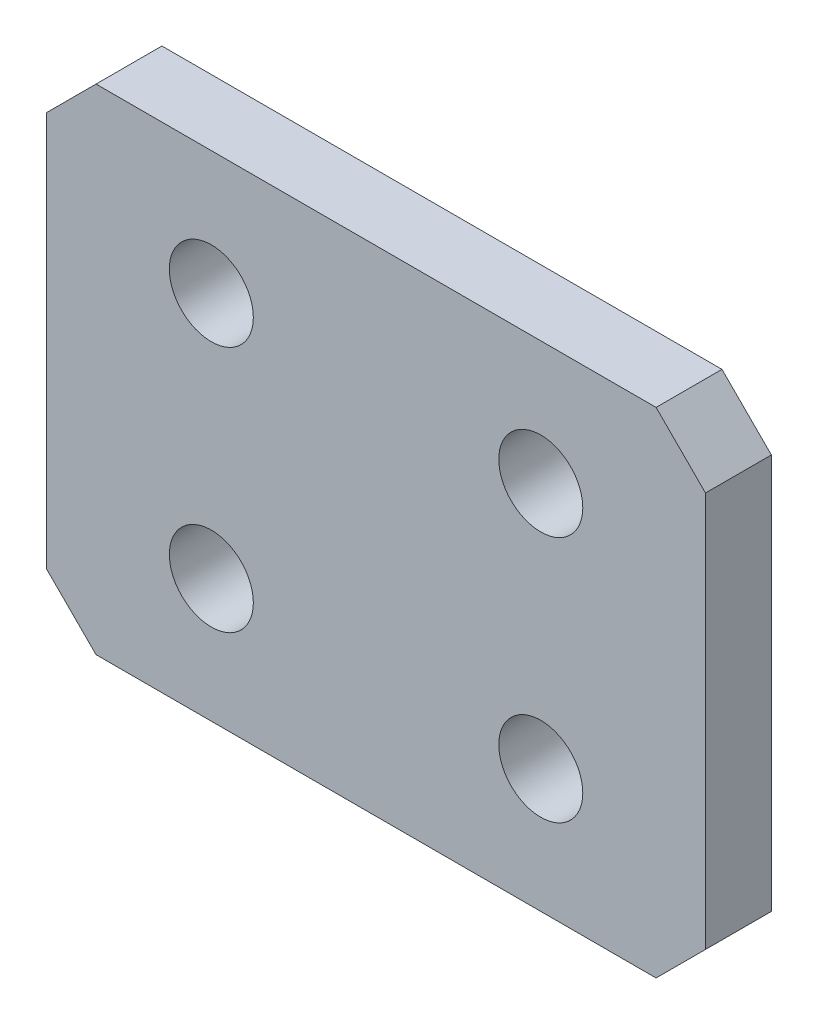
ISO-10303-21;
HEADER;
FILE_DESCRIPTION(('STEP AP214'),'2;1');
FILE_NAME('part.step','',(''),(''),'','','');
FILE_SCHEMA(('AUTOMOTIVE_DESIGN { 1 0 10303 214 1 1 1 1 }'));
ENDSEC;
DATA;
#1=APPLICATION_CONTEXT('core data for automotive mechanical design processes');
#2=APPLICATION_PROTOCOL_DEFINITION('international standard','automotive_design',2000,#1);
#3=PRODUCT_CONTEXT('',#1,'mechanical');
#4=PRODUCT('Part','Part','',(#3));
#5=PRODUCT_RELATED_PRODUCT_CATEGORY('part','',(#4));
#6=PRODUCT_DEFINITION_FORMATION('','',#4);
#7=PRODUCT_DEFINITION_CONTEXT('part definition',#1,'design');
#8=PRODUCT_DEFINITION('design','',#6,#7);
#9=PRODUCT_DEFINITION_SHAPE('','',#8);
#10=(LENGTH_UNIT() NAMED_UNIT(*) SI_UNIT(.MILLI.,.METRE.));
#11=(NAMED_UNIT(*) PLANE_ANGLE_UNIT() SI_UNIT($,.RADIAN.));
#12=(NAMED_UNIT(*) SI_UNIT($,.STERADIAN.) SOLID_ANGLE_UNIT());
#13=UNCERTAINTY_MEASURE_WITH_UNIT(LENGTH_MEASURE(1.E-05),#10,'distance_accuracy_value','');
#14=(GEOMETRIC_REPRESENTATION_CONTEXT(3) GLOBAL_UNCERTAINTY_ASSIGNED_CONTEXT((#13)) GLOBAL_UNIT_ASSIGNED_CONTEXT((#10,
#11,#12)) REPRESENTATION_CONTEXT('',''));
#15=CARTESIAN_POINT('',(0.,0.,0.));
#16=DIRECTION('',(0.,0.,1.));
#17=DIRECTION('',(1.,0.,0.));
#18=AXIS2_PLACEMENT_3D('',#15,#16,#17);
#19=CARTESIAN_POINT('',(20.,-15.,4.));
#20=DIRECTION('',(-1.,0.,0.));
#21=DIRECTION('',(0.,0.,1.));
#22=AXIS2_PLACEMENT_3D('',#19,#20,#21);
#23=PLANE('',#22);
#24=DIRECTION('',(0.,1.,0.));
#25=VECTOR('',#24,1.);
#26=CARTESIAN_POINT('',(20.,-15.,4.));
#27=LINE('',#26,#25);
#28=CARTESIAN_POINT('',(20.,-12.,4.));
#29=VERTEX_POINT('',#28);
#30=CARTESIAN_POINT('',(20.,12.,4.));
#31=VERTEX_POINT('',#30);
#32=EDGE_CURVE('E125',#29,#31,#27,.T.);
#33=ORIENTED_EDGE('',*,*,#32,.F.);
#34=DIRECTION('',(0.,0.,-1.));
#35=VECTOR('',#34,1.);
#36=CARTESIAN_POINT('',(20.,-12.,4.));
#37=LINE('',#36,#35);
#38=CARTESIAN_POINT('',(20.,-12.,0.));
#39=VERTEX_POINT('',#38);
#40=EDGE_CURVE('E110',#29,#39,#37,.T.);
#41=ORIENTED_EDGE('',*,*,#40,.T.);
#42=DIRECTION('',(0.,1.,0.));
#43=VECTOR('',#42,1.);
#44=CARTESIAN_POINT('',(20.,-15.,0.));
#45=LINE('',#44,#43);
#46=CARTESIAN_POINT('',(20.,12.,0.));
#47=VERTEX_POINT('',#46);
#48=EDGE_CURVE('E122',#39,#47,#45,.T.);
#49=ORIENTED_EDGE('',*,*,#48,.T.);
#50=DIRECTION('',(0.,0.,1.));
#51=VECTOR('',#50,1.);
#52=CARTESIAN_POINT('',(20.,12.,4.));
#53=LINE('',#52,#51);
#54=EDGE_CURVE('E127',#47,#31,#53,.T.);
#55=ORIENTED_EDGE('',*,*,#54,.T.);
#56=EDGE_LOOP('',(#33,#41,#49,#55));
#57=FACE_BOUND('',#56,.T.);
#58=ADVANCED_FACE('F38',(#57),#23,.F.);
#59=CARTESIAN_POINT('',(-20.,15.,4.));
#60=DIRECTION('',(0.,-1.,0.));
#61=DIRECTION('',(0.,0.,-1.));
#62=AXIS2_PLACEMENT_3D('',#59,#60,#61);
#63=PLANE('',#62);
#64=DIRECTION('',(-1.,0.,0.));
#65=VECTOR('',#64,1.);
#66=CARTESIAN_POINT('',(-20.,15.,4.));
#67=LINE('',#66,#65);
#68=CARTESIAN_POINT('',(17.,15.,4.));
#69=VERTEX_POINT('',#68);
#70=CARTESIAN_POINT('',(-17.,15.,4.));
#71=VERTEX_POINT('',#70);
#72=EDGE_CURVE('E169',#69,#71,#67,.T.);
#73=ORIENTED_EDGE('',*,*,#72,.F.);
#74=DIRECTION('',(0.,0.,-1.));
#75=VECTOR('',#74,1.);
#76=CARTESIAN_POINT('',(17.,15.,4.));
#77=LINE('',#76,#75);
#78=CARTESIAN_POINT('',(17.,15.,0.));
#79=VERTEX_POINT('',#78);
#80=EDGE_CURVE('E11',#69,#79,#77,.T.);
#81=ORIENTED_EDGE('',*,*,#80,.T.);
#82=DIRECTION('',(-1.,0.,0.));
#83=VECTOR('',#82,1.);
#84=CARTESIAN_POINT('',(-20.,15.,0.));
#85=LINE('',#84,#83);
#86=CARTESIAN_POINT('',(-17.,15.,0.));
#87=VERTEX_POINT('',#86);
#88=EDGE_CURVE('E132',#79,#87,#85,.T.);
#89=ORIENTED_EDGE('',*,*,#88,.T.);
#90=DIRECTION('',(0.,0.,1.));
#91=VECTOR('',#90,1.);
#92=CARTESIAN_POINT('',(-17.,15.,4.));
#93=LINE('',#92,#91);
#94=EDGE_CURVE('E47',#87,#71,#93,.T.);
#95=ORIENTED_EDGE('',*,*,#94,.T.);
#96=EDGE_LOOP('',(#73,#81,#89,#95));
#97=FACE_BOUND('',#96,.T.);
#98=ADVANCED_FACE('F168',(#97),#63,.F.);
#99=CARTESIAN_POINT('',(-20.,-15.,4.));
#100=DIRECTION('',(1.,0.,0.));
#101=DIRECTION('',(0.,0.,-1.));
#102=AXIS2_PLACEMENT_3D('',#99,#100,#101);
#103=PLANE('',#102);
#104=DIRECTION('',(0.,-1.,0.));
#105=VECTOR('',#104,1.);
#106=CARTESIAN_POINT('',(-20.,-15.,0.));
#107=LINE('',#106,#105);
#108=CARTESIAN_POINT('',(-20.,12.,0.));
#109=VERTEX_POINT('',#108);
#110=CARTESIAN_POINT('',(-20.,-12.,0.));
#111=VERTEX_POINT('',#110);
#112=EDGE_CURVE('E136',#109,#111,#107,.T.);
#113=ORIENTED_EDGE('',*,*,#112,.T.);
#114=DIRECTION('',(0.,0.,1.));
#115=VECTOR('',#114,1.);
#116=CARTESIAN_POINT('',(-20.,-12.,4.));
#117=LINE('',#116,#115);
#118=CARTESIAN_POINT('',(-20.,-12.,4.));
#119=VERTEX_POINT('',#118);
#120=EDGE_CURVE('E54',#111,#119,#117,.T.);
#121=ORIENTED_EDGE('',*,*,#120,.T.);
#122=DIRECTION('',(0.,-1.,0.));
#123=VECTOR('',#122,1.);
#124=CARTESIAN_POINT('',(-20.,-15.,4.));
#125=LINE('',#124,#123);
#126=CARTESIAN_POINT('',(-20.,12.,4.));
#127=VERTEX_POINT('',#126);
#128=EDGE_CURVE('E175',#127,#119,#125,.T.);
#129=ORIENTED_EDGE('',*,*,#128,.F.);
#130=DIRECTION('',(0.,0.,-1.));
#131=VECTOR('',#130,1.);
#132=CARTESIAN_POINT('',(-20.,12.,4.));
#133=LINE('',#132,#131);
#134=EDGE_CURVE('E162',#127,#109,#133,.T.);
#135=ORIENTED_EDGE('',*,*,#134,.T.);
#136=EDGE_LOOP('',(#113,#121,#129,#135));
#137=FACE_BOUND('',#136,.T.);
#138=ADVANCED_FACE('F179',(#137),#103,.F.);
#139=CARTESIAN_POINT('',(-20.,-15.,4.));
#140=DIRECTION('',(0.,1.,0.));
#141=DIRECTION('',(0.,0.,1.));
#142=AXIS2_PLACEMENT_3D('',#139,#140,#141);
#143=PLANE('',#142);
#144=DIRECTION('',(1.,0.,0.));
#145=VECTOR('',#144,1.);
#146=CARTESIAN_POINT('',(-20.,-15.,0.));
#147=LINE('',#146,#145);
#148=CARTESIAN_POINT('',(-17.,-15.,0.));
#149=VERTEX_POINT('',#148);
#150=CARTESIAN_POINT('',(17.,-15.,0.));
#151=VERTEX_POINT('',#150);
#152=EDGE_CURVE('E146',#149,#151,#147,.T.);
#153=ORIENTED_EDGE('',*,*,#152,.T.);
#154=DIRECTION('',(0.,0.,1.));
#155=VECTOR('',#154,1.);
#156=CARTESIAN_POINT('',(17.,-15.,4.));
#157=LINE('',#156,#155);
#158=CARTESIAN_POINT('',(17.,-15.,4.));
#159=VERTEX_POINT('',#158);
#160=EDGE_CURVE('E111',#151,#159,#157,.T.);
#161=ORIENTED_EDGE('',*,*,#160,.T.);
#162=DIRECTION('',(1.,0.,0.));
#163=VECTOR('',#162,1.);
#164=CARTESIAN_POINT('',(-20.,-15.,4.));
#165=LINE('',#164,#163);
#166=CARTESIAN_POINT('',(-17.,-15.,4.));
#167=VERTEX_POINT('',#166);
#168=EDGE_CURVE('E142',#167,#159,#165,.T.);
#169=ORIENTED_EDGE('',*,*,#168,.F.);
#170=DIRECTION('',(0.,0.,-1.));
#171=VECTOR('',#170,1.);
#172=CARTESIAN_POINT('',(-17.,-15.,4.));
#173=LINE('',#172,#171);
#174=EDGE_CURVE('E116',#167,#149,#173,.T.);
#175=ORIENTED_EDGE('',*,*,#174,.T.);
#176=EDGE_LOOP('',(#153,#161,#169,#175));
#177=FACE_BOUND('',#176,.T.);
#178=ADVANCED_FACE('F186',(#177),#143,.F.);
#179=CARTESIAN_POINT('',(0.,0.,4.));
#180=DIRECTION('',(0.,0.,-1.));
#181=DIRECTION('',(-1.,0.,0.));
#182=AXIS2_PLACEMENT_3D('',#179,#180,#181);
#183=PLANE('',#182);
#184=CARTESIAN_POINT('',(-10.,7.5,4.));
#185=DIRECTION('',(0.,0.,1.));
#186=DIRECTION('',(1.,0.,0.));
#187=AXIS2_PLACEMENT_3D('',#184,#185,#186);
#188=CIRCLE('',#187,2.55);
#189=CARTESIAN_POINT('',(-7.45,7.5,4.));
#190=VERTEX_POINT('',#189);
#191=EDGE_CURVE('E204',#190,#190,#188,.T.);
#192=ORIENTED_EDGE('',*,*,#191,.F.);
#193=EDGE_LOOP('',(#192));
#194=FACE_BOUND('',#193,.T.);
#195=CARTESIAN_POINT('',(-10.,-7.5,4.));
#196=DIRECTION('',(0.,0.,1.));
#197=DIRECTION('',(1.,0.,0.));
#198=AXIS2_PLACEMENT_3D('',#195,#196,#197);
#199=CIRCLE('',#198,2.55);
#200=CARTESIAN_POINT('',(-7.45,-7.5,4.));
#201=VERTEX_POINT('',#200);
#202=EDGE_CURVE('E198',#201,#201,#199,.T.);
#203=ORIENTED_EDGE('',*,*,#202,.F.);
#204=EDGE_LOOP('',(#203));
#205=FACE_BOUND('',#204,.T.);
#206=CARTESIAN_POINT('',(10.,7.5,4.));
#207=DIRECTION('',(0.,0.,1.));
#208=DIRECTION('',(1.,0.,0.));
#209=AXIS2_PLACEMENT_3D('',#206,#207,#208);
#210=CIRCLE('',#209,2.55);
#211=CARTESIAN_POINT('',(12.55,7.5,4.));
#212=VERTEX_POINT('',#211);
#213=EDGE_CURVE('E139',#212,#212,#210,.T.);
#214=ORIENTED_EDGE('',*,*,#213,.F.);
#215=EDGE_LOOP('',(#214));
#216=FACE_BOUND('',#215,.T.);
#217=CARTESIAN_POINT('',(10.,-7.5,4.));
#218=DIRECTION('',(0.,0.,1.));
#219=DIRECTION('',(1.,0.,0.));
#220=AXIS2_PLACEMENT_3D('',#217,#218,#219);
#221=CIRCLE('',#220,2.55);
#222=CARTESIAN_POINT('',(12.55,-7.5,4.));
#223=VERTEX_POINT('',#222);
#224=EDGE_CURVE('E189',#223,#223,#221,.T.);
#225=ORIENTED_EDGE('',*,*,#224,.F.);
#226=EDGE_LOOP('',(#225));
#227=FACE_BOUND('',#226,.T.);
#228=ORIENTED_EDGE('',*,*,#168,.T.);
#229=DIRECTION('',(-0.707106781186548,-0.707106781186547,0.));
#230=VECTOR('',#229,1.);
#231=CARTESIAN_POINT('',(20.,-12.,4.));
#232=LINE('',#231,#230);
#233=EDGE_CURVE('E160',#159,#29,#232,.F.);
#234=ORIENTED_EDGE('',*,*,#233,.T.);
#235=ORIENTED_EDGE('',*,*,#32,.T.);
#236=DIRECTION('',(0.707106781186547,-0.707106781186548,0.));
#237=VECTOR('',#236,1.);
#238=CARTESIAN_POINT('',(17.,15.,4.));
#239=LINE('',#238,#237);
#240=EDGE_CURVE('E156',#31,#69,#239,.F.);
#241=ORIENTED_EDGE('',*,*,#240,.T.);
#242=ORIENTED_EDGE('',*,*,#72,.T.);
#243=DIRECTION('',(0.707106781186549,0.707106781186546,0.));
#244=VECTOR('',#243,1.);
#245=CARTESIAN_POINT('',(-20.,12.,4.));
#246=LINE('',#245,#244);
#247=EDGE_CURVE('E61',#71,#127,#246,.F.);
#248=ORIENTED_EDGE('',*,*,#247,.T.);
#249=ORIENTED_EDGE('',*,*,#128,.T.);
#250=DIRECTION('',(-0.707106781186547,0.707106781186548,0.));
#251=VECTOR('',#250,1.);
#252=CARTESIAN_POINT('',(-17.,-15.,4.));
#253=LINE('',#252,#251);
#254=EDGE_CURVE('E158',#119,#167,#253,.F.);
#255=ORIENTED_EDGE('',*,*,#254,.T.);
#256=EDGE_LOOP('',(#228,#234,#235,#241,#242,#248,#249,#255));
#257=FACE_BOUND('',#256,.T.);
#258=ADVANCED_FACE('F173',(#194,#205,#216,#227,#257),#183,.F.);
#259=CARTESIAN_POINT('',(0.,0.,0.));
#260=DIRECTION('',(0.,0.,-1.));
#261=DIRECTION('',(-1.,0.,0.));
#262=AXIS2_PLACEMENT_3D('',#259,#260,#261);
#263=PLANE('',#262);
#264=CARTESIAN_POINT('',(-10.,7.5,0.));
#265=DIRECTION('',(0.,0.,1.));
#266=DIRECTION('',(1.,0.,0.));
#267=AXIS2_PLACEMENT_3D('',#264,#265,#266);
#268=CIRCLE('',#267,2.55);
#269=CARTESIAN_POINT('',(-7.45,7.5,0.));
#270=VERTEX_POINT('',#269);
#271=EDGE_CURVE('E193',#270,#270,#268,.T.);
#272=ORIENTED_EDGE('',*,*,#271,.T.);
#273=EDGE_LOOP('',(#272));
#274=FACE_BOUND('',#273,.T.);
#275=CARTESIAN_POINT('',(-10.,-7.5,0.));
#276=DIRECTION('',(0.,0.,1.));
#277=DIRECTION('',(1.,0.,0.));
#278=AXIS2_PLACEMENT_3D('',#275,#276,#277);
#279=CIRCLE('',#278,2.55);
#280=CARTESIAN_POINT('',(-7.45,-7.5,0.));
#281=VERTEX_POINT('',#280);
#282=EDGE_CURVE('E201',#281,#281,#279,.T.);
#283=ORIENTED_EDGE('',*,*,#282,.T.);
#284=EDGE_LOOP('',(#283));
#285=FACE_BOUND('',#284,.T.);
#286=CARTESIAN_POINT('',(10.,7.5,0.));
#287=DIRECTION('',(0.,0.,1.));
#288=DIRECTION('',(1.,0.,0.));
#289=AXIS2_PLACEMENT_3D('',#286,#287,#288);
#290=CIRCLE('',#289,2.55);
#291=CARTESIAN_POINT('',(12.55,7.5,0.));
#292=VERTEX_POINT('',#291);
#293=EDGE_CURVE('E133',#292,#292,#290,.T.);
#294=ORIENTED_EDGE('',*,*,#293,.T.);
#295=EDGE_LOOP('',(#294));
#296=FACE_BOUND('',#295,.T.);
#297=CARTESIAN_POINT('',(10.,-7.5,0.));
#298=DIRECTION('',(0.,0.,1.));
#299=DIRECTION('',(1.,0.,0.));
#300=AXIS2_PLACEMENT_3D('',#297,#298,#299);
#301=CIRCLE('',#300,2.55);
#302=CARTESIAN_POINT('',(12.55,-7.5,0.));
#303=VERTEX_POINT('',#302);
#304=EDGE_CURVE('E192',#303,#303,#301,.T.);
#305=ORIENTED_EDGE('',*,*,#304,.T.);
#306=EDGE_LOOP('',(#305));
#307=FACE_BOUND('',#306,.T.);
#308=ORIENTED_EDGE('',*,*,#48,.F.);
#309=DIRECTION('',(0.707106781186548,0.707106781186547,0.));
#310=VECTOR('',#309,1.);
#311=CARTESIAN_POINT('',(16.,-16.,0.));
#312=LINE('',#311,#310);
#313=EDGE_CURVE('E106',#39,#151,#312,.F.);
#314=ORIENTED_EDGE('',*,*,#313,.T.);
#315=ORIENTED_EDGE('',*,*,#152,.F.);
#316=DIRECTION('',(0.707106781186547,-0.707106781186548,0.));
#317=VECTOR('',#316,1.);
#318=CARTESIAN_POINT('',(-16.,-16.,0.));
#319=LINE('',#318,#317);
#320=EDGE_CURVE('E117',#149,#111,#319,.F.);
#321=ORIENTED_EDGE('',*,*,#320,.T.);
#322=ORIENTED_EDGE('',*,*,#112,.F.);
#323=DIRECTION('',(-0.707106781186549,-0.707106781186546,0.));
#324=VECTOR('',#323,1.);
#325=CARTESIAN_POINT('',(-16.,16.,0.));
#326=LINE('',#325,#324);
#327=EDGE_CURVE('E126',#109,#87,#326,.F.);
#328=ORIENTED_EDGE('',*,*,#327,.T.);
#329=ORIENTED_EDGE('',*,*,#88,.F.);
#330=DIRECTION('',(-0.707106781186547,0.707106781186548,0.));
#331=VECTOR('',#330,1.);
#332=CARTESIAN_POINT('',(16.,16.,0.));
#333=LINE('',#332,#331);
#334=EDGE_CURVE('E131',#79,#47,#333,.F.);
#335=ORIENTED_EDGE('',*,*,#334,.T.);
#336=EDGE_LOOP('',(#308,#314,#315,#321,#322,#328,#329,#335));
#337=FACE_BOUND('',#336,.T.);
#338=ADVANCED_FACE('F129',(#274,#285,#296,#307,#337),#263,.T.);
#339=CARTESIAN_POINT('',(10.,-7.5,0.));
#340=DIRECTION('',(0.,0.,1.));
#341=DIRECTION('',(1.,0.,0.));
#342=AXIS2_PLACEMENT_3D('',#339,#340,#341);
#343=CYLINDRICAL_SURFACE('',#342,2.55);
#344=ORIENTED_EDGE('',*,*,#304,.F.);
#345=EDGE_LOOP('',(#344));
#346=FACE_BOUND('',#345,.T.);
#347=ORIENTED_EDGE('',*,*,#224,.T.);
#348=EDGE_LOOP('',(#347));
#349=FACE_BOUND('',#348,.T.);
#350=ADVANCED_FACE('F228',(#346,#349),#343,.F.);
#351=CARTESIAN_POINT('',(10.,7.5,0.));
#352=DIRECTION('',(0.,0.,1.));
#353=DIRECTION('',(1.,0.,0.));
#354=AXIS2_PLACEMENT_3D('',#351,#352,#353);
#355=CYLINDRICAL_SURFACE('',#354,2.55);
#356=ORIENTED_EDGE('',*,*,#293,.F.);
#357=EDGE_LOOP('',(#356));
#358=FACE_BOUND('',#357,.T.);
#359=ORIENTED_EDGE('',*,*,#213,.T.);
#360=EDGE_LOOP('',(#359));
#361=FACE_BOUND('',#360,.T.);
#362=ADVANCED_FACE('F230',(#358,#361),#355,.F.);
#363=CARTESIAN_POINT('',(20.,-12.,4.));
#364=DIRECTION('',(-0.707106781186547,0.707106781186548,0.));
#365=DIRECTION('',(0.,0.,-1.));
#366=AXIS2_PLACEMENT_3D('',#363,#364,#365);
#367=PLANE('',#366);
#368=ORIENTED_EDGE('',*,*,#233,.F.);
#369=ORIENTED_EDGE('',*,*,#160,.F.);
#370=ORIENTED_EDGE('',*,*,#313,.F.);
#371=ORIENTED_EDGE('',*,*,#40,.F.);
#372=EDGE_LOOP('',(#368,#369,#370,#371));
#373=FACE_BOUND('',#372,.T.);
#374=ADVANCED_FACE('F109',(#373),#367,.F.);
#375=CARTESIAN_POINT('',(-17.,-15.,4.));
#376=DIRECTION('',(0.707106781186548,0.707106781186547,0.));
#377=DIRECTION('',(0.,0.,-1.));
#378=AXIS2_PLACEMENT_3D('',#375,#376,#377);
#379=PLANE('',#378);
#380=ORIENTED_EDGE('',*,*,#254,.F.);
#381=ORIENTED_EDGE('',*,*,#120,.F.);
#382=ORIENTED_EDGE('',*,*,#320,.F.);
#383=ORIENTED_EDGE('',*,*,#174,.F.);
#384=EDGE_LOOP('',(#380,#381,#382,#383));
#385=FACE_BOUND('',#384,.T.);
#386=ADVANCED_FACE('F183',(#385),#379,.F.);
#387=CARTESIAN_POINT('',(17.,15.,4.));
#388=DIRECTION('',(-0.707106781186548,-0.707106781186547,0.));
#389=DIRECTION('',(0.,0.,-1.));
#390=AXIS2_PLACEMENT_3D('',#387,#388,#389);
#391=PLANE('',#390);
#392=ORIENTED_EDGE('',*,*,#240,.F.);
#393=ORIENTED_EDGE('',*,*,#54,.F.);
#394=ORIENTED_EDGE('',*,*,#334,.F.);
#395=ORIENTED_EDGE('',*,*,#80,.F.);
#396=EDGE_LOOP('',(#392,#393,#394,#395));
#397=FACE_BOUND('',#396,.T.);
#398=ADVANCED_FACE('F259',(#397),#391,.F.);
#399=CARTESIAN_POINT('',(-20.,12.,4.));
#400=DIRECTION('',(0.707106781186546,-0.707106781186549,0.));
#401=DIRECTION('',(0.,0.,-1.));
#402=AXIS2_PLACEMENT_3D('',#399,#400,#401);
#403=PLANE('',#402);
#404=ORIENTED_EDGE('',*,*,#247,.F.);
#405=ORIENTED_EDGE('',*,*,#94,.F.);
#406=ORIENTED_EDGE('',*,*,#327,.F.);
#407=ORIENTED_EDGE('',*,*,#134,.F.);
#408=EDGE_LOOP('',(#404,#405,#406,#407));
#409=FACE_BOUND('',#408,.T.);
#410=ADVANCED_FACE('F41',(#409),#403,.F.);
#411=CARTESIAN_POINT('',(-10.,-7.5,0.));
#412=DIRECTION('',(0.,0.,1.));
#413=DIRECTION('',(1.,0.,0.));
#414=AXIS2_PLACEMENT_3D('',#411,#412,#413);
#415=CYLINDRICAL_SURFACE('',#414,2.55);
#416=ORIENTED_EDGE('',*,*,#282,.F.);
#417=EDGE_LOOP('',(#416));
#418=FACE_BOUND('',#417,.T.);
#419=ORIENTED_EDGE('',*,*,#202,.T.);
#420=EDGE_LOOP('',(#419));
#421=FACE_BOUND('',#420,.T.);
#422=ADVANCED_FACE('F215',(#418,#421),#415,.F.);
#423=CARTESIAN_POINT('',(-10.,7.5,0.));
#424=DIRECTION('',(0.,0.,1.));
#425=DIRECTION('',(1.,0.,0.));
#426=AXIS2_PLACEMENT_3D('',#423,#424,#425);
#427=CYLINDRICAL_SURFACE('',#426,2.55);
#428=ORIENTED_EDGE('',*,*,#271,.F.);
#429=EDGE_LOOP('',(#428));
#430=FACE_BOUND('',#429,.T.);
#431=ORIENTED_EDGE('',*,*,#191,.T.);
#432=EDGE_LOOP('',(#431));
#433=FACE_BOUND('',#432,.T.);
#434=ADVANCED_FACE('F212',(#430,#433),#427,.F.);
#435=CLOSED_SHELL('',(#58,#98,#138,#178,#258,#338,#350,#362,#374,#386,#398,#410,#422,#434));
#436=MANIFOLD_SOLID_BREP('B2',#435);
#437=ADVANCED_BREP_SHAPE_REPRESENTATION('',(#18,#436),#14);
#438=SHAPE_DEFINITION_REPRESENTATION(#9,#437);
ENDSEC;
END-ISO-10303-21;
